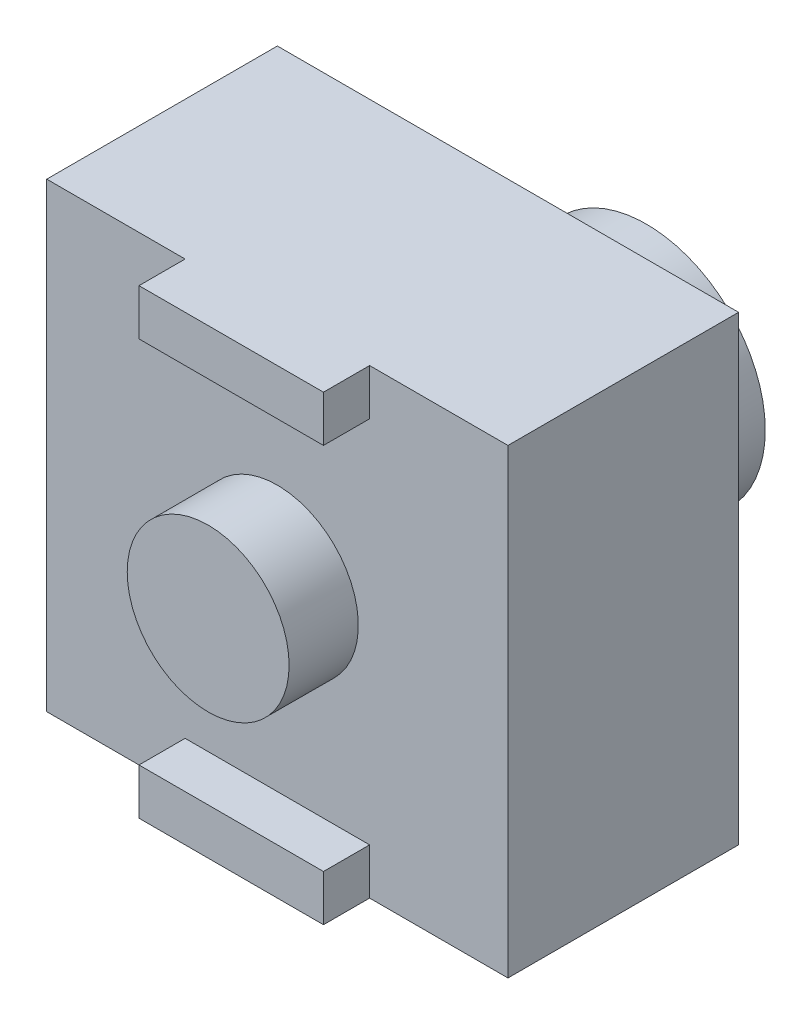
ISO-10303-21;
HEADER;
FILE_DESCRIPTION(('STEP AP214'),'2;1');
FILE_NAME('part.step','',(''),(''),'','','');
FILE_SCHEMA(('AUTOMOTIVE_DESIGN { 1 0 10303 214 1 1 1 1 }'));
ENDSEC;
DATA;
#1=APPLICATION_CONTEXT('core data for automotive mechanical design processes');
#2=APPLICATION_PROTOCOL_DEFINITION('international standard','automotive_design',2000,#1);
#3=PRODUCT_CONTEXT('',#1,'mechanical');
#4=PRODUCT('Part','Part','',(#3));
#5=PRODUCT_RELATED_PRODUCT_CATEGORY('part','',(#4));
#6=PRODUCT_DEFINITION_FORMATION('','',#4);
#7=PRODUCT_DEFINITION_CONTEXT('part definition',#1,'design');
#8=PRODUCT_DEFINITION('design','',#6,#7);
#9=PRODUCT_DEFINITION_SHAPE('','',#8);
#10=(LENGTH_UNIT() NAMED_UNIT(*) SI_UNIT(.MILLI.,.METRE.));
#11=(NAMED_UNIT(*) PLANE_ANGLE_UNIT() SI_UNIT($,.RADIAN.));
#12=(NAMED_UNIT(*) SI_UNIT($,.STERADIAN.) SOLID_ANGLE_UNIT());
#13=UNCERTAINTY_MEASURE_WITH_UNIT(LENGTH_MEASURE(1.E-05),#10,'distance_accuracy_value','');
#14=(GEOMETRIC_REPRESENTATION_CONTEXT(3) GLOBAL_UNCERTAINTY_ASSIGNED_CONTEXT((#13)) GLOBAL_UNIT_ASSIGNED_CONTEXT((#10,
#11,#12)) REPRESENTATION_CONTEXT('',''));
#15=CARTESIAN_POINT('',(0.,0.,0.));
#16=DIRECTION('',(0.,0.,1.));
#17=DIRECTION('',(1.,0.,0.));
#18=AXIS2_PLACEMENT_3D('',#15,#16,#17);
#19=CARTESIAN_POINT('',(0.,0.,5.));
#20=DIRECTION('',(0.,0.,-1.));
#21=DIRECTION('',(-1.,0.,0.));
#22=AXIS2_PLACEMENT_3D('',#19,#20,#21);
#23=PLANE('',#22);
#24=DIRECTION('',(1.,0.,0.));
#25=VECTOR('',#24,1.);
#26=CARTESIAN_POINT('',(0.,0.,5.));
#27=LINE('',#26,#25);
#28=CARTESIAN_POINT('',(0.,0.,5.));
#29=VERTEX_POINT('',#28);
#30=CARTESIAN_POINT('',(3.,0.,5.));
#31=VERTEX_POINT('',#30);
#32=EDGE_CURVE('E240',#29,#31,#27,.T.);
#33=ORIENTED_EDGE('',*,*,#32,.T.);
#34=DIRECTION('',(0.,1.,0.));
#35=VECTOR('',#34,1.);
#36=CARTESIAN_POINT('',(3.,0.,5.));
#37=LINE('',#36,#35);
#38=CARTESIAN_POINT('',(3.,0.999999999999999,5.));
#39=VERTEX_POINT('',#38);
#40=EDGE_CURVE('E62',#31,#39,#37,.T.);
#41=ORIENTED_EDGE('',*,*,#40,.T.);
#42=DIRECTION('',(1.,0.,0.));
#43=VECTOR('',#42,1.);
#44=CARTESIAN_POINT('',(3.,0.999999999999999,5.));
#45=LINE('',#44,#43);
#46=CARTESIAN_POINT('',(7.,0.999999999999997,5.));
#47=VERTEX_POINT('',#46);
#48=EDGE_CURVE('E57',#39,#47,#45,.T.);
#49=ORIENTED_EDGE('',*,*,#48,.T.);
#50=DIRECTION('',(0.,-1.,0.));
#51=VECTOR('',#50,1.);
#52=CARTESIAN_POINT('',(7.,0.,5.));
#53=LINE('',#52,#51);
#54=CARTESIAN_POINT('',(7.,0.,5.));
#55=VERTEX_POINT('',#54);
#56=EDGE_CURVE('E165',#47,#55,#53,.T.);
#57=ORIENTED_EDGE('',*,*,#56,.T.);
#58=CARTESIAN_POINT('',(10.,0.,5.));
#59=VERTEX_POINT('',#58);
#60=EDGE_CURVE('E238',#55,#59,#27,.T.);
#61=ORIENTED_EDGE('',*,*,#60,.T.);
#62=DIRECTION('',(0.,1.,0.));
#63=VECTOR('',#62,1.);
#64=CARTESIAN_POINT('',(10.,0.,5.));
#65=LINE('',#64,#63);
#66=CARTESIAN_POINT('',(10.,10.,5.));
#67=VERTEX_POINT('',#66);
#68=EDGE_CURVE('E243',#59,#67,#65,.T.);
#69=ORIENTED_EDGE('',*,*,#68,.T.);
#70=DIRECTION('',(-1.,0.,0.));
#71=VECTOR('',#70,1.);
#72=CARTESIAN_POINT('',(0.,10.,5.));
#73=LINE('',#72,#71);
#74=CARTESIAN_POINT('',(7.,10.,5.));
#75=VERTEX_POINT('',#74);
#76=EDGE_CURVE('E247',#67,#75,#73,.T.);
#77=ORIENTED_EDGE('',*,*,#76,.T.);
#78=DIRECTION('',(0.,1.,0.));
#79=VECTOR('',#78,1.);
#80=CARTESIAN_POINT('',(7.,10.,5.));
#81=LINE('',#80,#79);
#82=CARTESIAN_POINT('',(7.,9.,5.));
#83=VERTEX_POINT('',#82);
#84=EDGE_CURVE('E182',#83,#75,#81,.T.);
#85=ORIENTED_EDGE('',*,*,#84,.F.);
#86=DIRECTION('',(1.,0.,0.));
#87=VECTOR('',#86,1.);
#88=CARTESIAN_POINT('',(3.,9.,5.));
#89=LINE('',#88,#87);
#90=CARTESIAN_POINT('',(3.,9.,5.));
#91=VERTEX_POINT('',#90);
#92=EDGE_CURVE('E195',#91,#83,#89,.T.);
#93=ORIENTED_EDGE('',*,*,#92,.F.);
#94=DIRECTION('',(0.,-1.,0.));
#95=VECTOR('',#94,1.);
#96=CARTESIAN_POINT('',(3.,10.,5.));
#97=LINE('',#96,#95);
#98=CARTESIAN_POINT('',(3.,10.,5.));
#99=VERTEX_POINT('',#98);
#100=EDGE_CURVE('E139',#99,#91,#97,.T.);
#101=ORIENTED_EDGE('',*,*,#100,.F.);
#102=CARTESIAN_POINT('',(0.,10.,5.));
#103=VERTEX_POINT('',#102);
#104=EDGE_CURVE('E246',#99,#103,#73,.T.);
#105=ORIENTED_EDGE('',*,*,#104,.T.);
#106=DIRECTION('',(0.,-1.,0.));
#107=VECTOR('',#106,1.);
#108=CARTESIAN_POINT('',(0.,0.,5.));
#109=LINE('',#108,#107);
#110=EDGE_CURVE('E234',#103,#29,#109,.T.);
#111=ORIENTED_EDGE('',*,*,#110,.T.);
#112=EDGE_LOOP('',(#33,#41,#49,#57,#61,#69,#77,#85,#93,#101,#105,#111));
#113=FACE_BOUND('',#112,.T.);
#114=CARTESIAN_POINT('',(5.,5.,5.));
#115=DIRECTION('',(0.,0.,-1.));
#116=DIRECTION('',(-1.,0.,0.));
#117=AXIS2_PLACEMENT_3D('',#114,#115,#116);
#118=CIRCLE('',#117,1.755);
#119=CARTESIAN_POINT('',(3.245,5.,5.));
#120=VERTEX_POINT('',#119);
#121=EDGE_CURVE('E221',#120,#120,#118,.F.);
#122=ORIENTED_EDGE('',*,*,#121,.F.);
#123=EDGE_LOOP('',(#122));
#124=FACE_BOUND('',#123,.T.);
#125=ADVANCED_FACE('F41',(#113,#124),#23,.F.);
#126=CARTESIAN_POINT('',(0.,0.,5.));
#127=DIRECTION('',(1.,0.,0.));
#128=DIRECTION('',(0.,0.,-1.));
#129=AXIS2_PLACEMENT_3D('',#126,#127,#128);
#130=PLANE('',#129);
#131=DIRECTION('',(0.,-1.,0.));
#132=VECTOR('',#131,1.);
#133=CARTESIAN_POINT('',(0.,0.,0.));
#134=LINE('',#133,#132);
#135=CARTESIAN_POINT('',(0.,10.,0.));
#136=VERTEX_POINT('',#135);
#137=CARTESIAN_POINT('',(0.,0.,0.));
#138=VERTEX_POINT('',#137);
#139=EDGE_CURVE('E233',#136,#138,#134,.T.);
#140=ORIENTED_EDGE('',*,*,#139,.T.);
#141=DIRECTION('',(0.,0.,-1.));
#142=VECTOR('',#141,1.);
#143=CARTESIAN_POINT('',(0.,0.,5.));
#144=LINE('',#143,#142);
#145=EDGE_CURVE('E11',#29,#138,#144,.T.);
#146=ORIENTED_EDGE('',*,*,#145,.F.);
#147=ORIENTED_EDGE('',*,*,#110,.F.);
#148=DIRECTION('',(0.,0.,-1.));
#149=VECTOR('',#148,1.);
#150=CARTESIAN_POINT('',(0.,10.,5.));
#151=LINE('',#150,#149);
#152=EDGE_CURVE('E250',#103,#136,#151,.T.);
#153=ORIENTED_EDGE('',*,*,#152,.T.);
#154=EDGE_LOOP('',(#140,#146,#147,#153));
#155=FACE_BOUND('',#154,.T.);
#156=ADVANCED_FACE('F43',(#155),#130,.F.);
#157=CARTESIAN_POINT('',(0.,0.,5.));
#158=DIRECTION('',(0.,1.,0.));
#159=DIRECTION('',(0.,0.,1.));
#160=AXIS2_PLACEMENT_3D('',#157,#158,#159);
#161=PLANE('',#160);
#162=DIRECTION('',(1.,0.,0.));
#163=VECTOR('',#162,1.);
#164=CARTESIAN_POINT('',(0.,0.,0.));
#165=LINE('',#164,#163);
#166=CARTESIAN_POINT('',(10.,0.,0.));
#167=VERTEX_POINT('',#166);
#168=EDGE_CURVE('E254',#138,#167,#165,.T.);
#169=ORIENTED_EDGE('',*,*,#168,.T.);
#170=DIRECTION('',(0.,0.,-1.));
#171=VECTOR('',#170,1.);
#172=CARTESIAN_POINT('',(10.,0.,5.));
#173=LINE('',#172,#171);
#174=EDGE_CURVE('E50',#59,#167,#173,.T.);
#175=ORIENTED_EDGE('',*,*,#174,.F.);
#176=ORIENTED_EDGE('',*,*,#60,.F.);
#177=DIRECTION('',(0.,0.,-1.));
#178=VECTOR('',#177,1.);
#179=CARTESIAN_POINT('',(7.,0.,6.));
#180=LINE('',#179,#178);
#181=CARTESIAN_POINT('',(7.,0.,6.));
#182=VERTEX_POINT('',#181);
#183=EDGE_CURVE('E140',#182,#55,#180,.T.);
#184=ORIENTED_EDGE('',*,*,#183,.F.);
#185=DIRECTION('',(-1.,0.,0.));
#186=VECTOR('',#185,1.);
#187=CARTESIAN_POINT('',(3.,0.,6.));
#188=LINE('',#187,#186);
#189=CARTESIAN_POINT('',(3.,0.,6.));
#190=VERTEX_POINT('',#189);
#191=EDGE_CURVE('E146',#182,#190,#188,.T.);
#192=ORIENTED_EDGE('',*,*,#191,.T.);
#193=DIRECTION('',(0.,0.,-1.));
#194=VECTOR('',#193,1.);
#195=CARTESIAN_POINT('',(3.,0.,6.));
#196=LINE('',#195,#194);
#197=EDGE_CURVE('E131',#190,#31,#196,.T.);
#198=ORIENTED_EDGE('',*,*,#197,.T.);
#199=ORIENTED_EDGE('',*,*,#32,.F.);
#200=ORIENTED_EDGE('',*,*,#145,.T.);
#201=EDGE_LOOP('',(#169,#175,#176,#184,#192,#198,#199,#200));
#202=FACE_BOUND('',#201,.T.);
#203=ADVANCED_FACE('F152',(#202),#161,.F.);
#204=CARTESIAN_POINT('',(10.,0.,5.));
#205=DIRECTION('',(-1.,0.,0.));
#206=DIRECTION('',(0.,0.,1.));
#207=AXIS2_PLACEMENT_3D('',#204,#205,#206);
#208=PLANE('',#207);
#209=DIRECTION('',(0.,1.,0.));
#210=VECTOR('',#209,1.);
#211=CARTESIAN_POINT('',(10.,0.,0.));
#212=LINE('',#211,#210);
#213=CARTESIAN_POINT('',(10.,10.,0.));
#214=VERTEX_POINT('',#213);
#215=EDGE_CURVE('E257',#167,#214,#212,.T.);
#216=ORIENTED_EDGE('',*,*,#215,.T.);
#217=DIRECTION('',(0.,0.,-1.));
#218=VECTOR('',#217,1.);
#219=CARTESIAN_POINT('',(10.,10.,5.));
#220=LINE('',#219,#218);
#221=EDGE_CURVE('E265',#67,#214,#220,.T.);
#222=ORIENTED_EDGE('',*,*,#221,.F.);
#223=ORIENTED_EDGE('',*,*,#68,.F.);
#224=ORIENTED_EDGE('',*,*,#174,.T.);
#225=EDGE_LOOP('',(#216,#222,#223,#224));
#226=FACE_BOUND('',#225,.T.);
#227=ADVANCED_FACE('F274',(#226),#208,.F.);
#228=CARTESIAN_POINT('',(0.,10.,5.));
#229=DIRECTION('',(0.,-1.,0.));
#230=DIRECTION('',(0.,0.,-1.));
#231=AXIS2_PLACEMENT_3D('',#228,#229,#230);
#232=PLANE('',#231);
#233=DIRECTION('',(-1.,0.,0.));
#234=VECTOR('',#233,1.);
#235=CARTESIAN_POINT('',(0.,10.,0.));
#236=LINE('',#235,#234);
#237=EDGE_CURVE('E239',#214,#136,#236,.T.);
#238=ORIENTED_EDGE('',*,*,#237,.T.);
#239=ORIENTED_EDGE('',*,*,#152,.F.);
#240=ORIENTED_EDGE('',*,*,#104,.F.);
#241=DIRECTION('',(0.,0.,-1.));
#242=VECTOR('',#241,1.);
#243=CARTESIAN_POINT('',(3.,10.,6.));
#244=LINE('',#243,#242);
#245=CARTESIAN_POINT('',(3.,10.,6.));
#246=VERTEX_POINT('',#245);
#247=EDGE_CURVE('E191',#246,#99,#244,.T.);
#248=ORIENTED_EDGE('',*,*,#247,.F.);
#249=DIRECTION('',(-1.,0.,0.));
#250=VECTOR('',#249,1.);
#251=CARTESIAN_POINT('',(3.,10.,6.));
#252=LINE('',#251,#250);
#253=CARTESIAN_POINT('',(7.,10.,6.));
#254=VERTEX_POINT('',#253);
#255=EDGE_CURVE('E188',#254,#246,#252,.T.);
#256=ORIENTED_EDGE('',*,*,#255,.F.);
#257=DIRECTION('',(0.,0.,-1.));
#258=VECTOR('',#257,1.);
#259=CARTESIAN_POINT('',(7.,10.,6.));
#260=LINE('',#259,#258);
#261=EDGE_CURVE('E205',#254,#75,#260,.T.);
#262=ORIENTED_EDGE('',*,*,#261,.T.);
#263=ORIENTED_EDGE('',*,*,#76,.F.);
#264=ORIENTED_EDGE('',*,*,#221,.T.);
#265=EDGE_LOOP('',(#238,#239,#240,#248,#256,#262,#263,#264));
#266=FACE_BOUND('',#265,.T.);
#267=ADVANCED_FACE('F282',(#266),#232,.F.);
#268=CARTESIAN_POINT('',(0.,0.,0.));
#269=DIRECTION('',(0.,0.,-1.));
#270=DIRECTION('',(-1.,0.,0.));
#271=AXIS2_PLACEMENT_3D('',#268,#269,#270);
#272=PLANE('',#271);
#273=CARTESIAN_POINT('',(5.,5.07854843993545,0.));
#274=DIRECTION('',(0.,0.,-1.));
#275=DIRECTION('',(-1.,0.,0.));
#276=AXIS2_PLACEMENT_3D('',#273,#274,#275);
#277=CIRCLE('',#276,2.57854843993545);
#278=CARTESIAN_POINT('',(2.42145156006455,5.07854843993545,0.));
#279=VERTEX_POINT('',#278);
#280=EDGE_CURVE('E229',#279,#279,#277,.F.);
#281=ORIENTED_EDGE('',*,*,#280,.T.);
#282=EDGE_LOOP('',(#281));
#283=FACE_BOUND('',#282,.T.);
#284=ORIENTED_EDGE('',*,*,#139,.F.);
#285=ORIENTED_EDGE('',*,*,#237,.F.);
#286=ORIENTED_EDGE('',*,*,#215,.F.);
#287=ORIENTED_EDGE('',*,*,#168,.F.);
#288=EDGE_LOOP('',(#284,#285,#286,#287));
#289=FACE_BOUND('',#288,.T.);
#290=ADVANCED_FACE('F279',(#283,#289),#272,.T.);
#291=CARTESIAN_POINT('',(5.,5.07854843993545,-3.));
#292=DIRECTION('',(0.,0.,1.));
#293=DIRECTION('',(1.,0.,0.));
#294=AXIS2_PLACEMENT_3D('',#291,#292,#293);
#295=CYLINDRICAL_SURFACE('',#294,2.57854843993545);
#296=ORIENTED_EDGE('',*,*,#280,.F.);
#297=EDGE_LOOP('',(#296));
#298=FACE_BOUND('',#297,.T.);
#299=CARTESIAN_POINT('',(5.,5.07854843993545,-3.));
#300=DIRECTION('',(0.,0.,-1.));
#301=DIRECTION('',(-1.,0.,0.));
#302=AXIS2_PLACEMENT_3D('',#299,#300,#301);
#303=CIRCLE('',#302,2.57854843993545);
#304=CARTESIAN_POINT('',(2.42145156006455,5.07854843993545,-3.));
#305=VERTEX_POINT('',#304);
#306=EDGE_CURVE('E225',#305,#305,#303,.T.);
#307=ORIENTED_EDGE('',*,*,#306,.F.);
#308=EDGE_LOOP('',(#307));
#309=FACE_BOUND('',#308,.T.);
#310=ADVANCED_FACE('F312',(#298,#309),#295,.T.);
#311=CARTESIAN_POINT('',(5.,5.07854843993545,-3.));
#312=DIRECTION('',(0.,0.,-1.));
#313=DIRECTION('',(-1.,0.,0.));
#314=AXIS2_PLACEMENT_3D('',#311,#312,#313);
#315=PLANE('',#314);
#316=ORIENTED_EDGE('',*,*,#306,.T.);
#317=EDGE_LOOP('',(#316));
#318=FACE_BOUND('',#317,.T.);
#319=ADVANCED_FACE('F347',(#318),#315,.T.);
#320=CARTESIAN_POINT('',(5.,5.,6.5));
#321=DIRECTION('',(0.,0.,-1.));
#322=DIRECTION('',(-1.,0.,0.));
#323=AXIS2_PLACEMENT_3D('',#320,#321,#322);
#324=CYLINDRICAL_SURFACE('',#323,1.755);
#325=CARTESIAN_POINT('',(5.,5.,6.5));
#326=DIRECTION('',(0.,0.,1.));
#327=DIRECTION('',(1.,0.,0.));
#328=AXIS2_PLACEMENT_3D('',#325,#326,#327);
#329=CIRCLE('',#328,1.755);
#330=CARTESIAN_POINT('',(6.755,5.,6.5));
#331=VERTEX_POINT('',#330);
#332=EDGE_CURVE('E217',#331,#331,#329,.T.);
#333=ORIENTED_EDGE('',*,*,#332,.F.);
#334=EDGE_LOOP('',(#333));
#335=FACE_BOUND('',#334,.T.);
#336=ORIENTED_EDGE('',*,*,#121,.T.);
#337=EDGE_LOOP('',(#336));
#338=FACE_BOUND('',#337,.T.);
#339=ADVANCED_FACE('F354',(#335,#338),#324,.T.);
#340=CARTESIAN_POINT('',(5.,5.,6.5));
#341=DIRECTION('',(0.,0.,1.));
#342=DIRECTION('',(1.,0.,0.));
#343=AXIS2_PLACEMENT_3D('',#340,#341,#342);
#344=PLANE('',#343);
#345=ORIENTED_EDGE('',*,*,#332,.T.);
#346=EDGE_LOOP('',(#345));
#347=FACE_BOUND('',#346,.T.);
#348=ADVANCED_FACE('F360',(#347),#344,.T.);
#349=CARTESIAN_POINT('',(3.,10.,6.));
#350=DIRECTION('',(1.,0.,0.));
#351=DIRECTION('',(0.,1.,0.));
#352=AXIS2_PLACEMENT_3D('',#349,#350,#351);
#353=PLANE('',#352);
#354=ORIENTED_EDGE('',*,*,#100,.T.);
#355=DIRECTION('',(0.,0.,-1.));
#356=VECTOR('',#355,1.);
#357=CARTESIAN_POINT('',(3.,9.,6.));
#358=LINE('',#357,#356);
#359=CARTESIAN_POINT('',(3.,9.,6.));
#360=VERTEX_POINT('',#359);
#361=EDGE_CURVE('E213',#360,#91,#358,.T.);
#362=ORIENTED_EDGE('',*,*,#361,.F.);
#363=DIRECTION('',(0.,-1.,0.));
#364=VECTOR('',#363,1.);
#365=CARTESIAN_POINT('',(3.,10.,6.));
#366=LINE('',#365,#364);
#367=EDGE_CURVE('E177',#246,#360,#366,.T.);
#368=ORIENTED_EDGE('',*,*,#367,.F.);
#369=ORIENTED_EDGE('',*,*,#247,.T.);
#370=EDGE_LOOP('',(#354,#362,#368,#369));
#371=FACE_BOUND('',#370,.T.);
#372=ADVANCED_FACE('F368',(#371),#353,.F.);
#373=CARTESIAN_POINT('',(3.,9.,6.));
#374=DIRECTION('',(0.,1.,0.));
#375=DIRECTION('',(-1.,0.,0.));
#376=AXIS2_PLACEMENT_3D('',#373,#374,#375);
#377=PLANE('',#376);
#378=ORIENTED_EDGE('',*,*,#92,.T.);
#379=DIRECTION('',(0.,0.,-1.));
#380=VECTOR('',#379,1.);
#381=CARTESIAN_POINT('',(7.,9.,6.));
#382=LINE('',#381,#380);
#383=CARTESIAN_POINT('',(7.,9.,6.));
#384=VERTEX_POINT('',#383);
#385=EDGE_CURVE('E209',#384,#83,#382,.T.);
#386=ORIENTED_EDGE('',*,*,#385,.F.);
#387=DIRECTION('',(1.,0.,0.));
#388=VECTOR('',#387,1.);
#389=CARTESIAN_POINT('',(3.,9.,6.));
#390=LINE('',#389,#388);
#391=EDGE_CURVE('E181',#360,#384,#390,.T.);
#392=ORIENTED_EDGE('',*,*,#391,.F.);
#393=ORIENTED_EDGE('',*,*,#361,.T.);
#394=EDGE_LOOP('',(#378,#386,#392,#393));
#395=FACE_BOUND('',#394,.T.);
#396=ADVANCED_FACE('F374',(#395),#377,.F.);
#397=CARTESIAN_POINT('',(7.,10.,6.));
#398=DIRECTION('',(-1.,0.,0.));
#399=DIRECTION('',(0.,0.,1.));
#400=AXIS2_PLACEMENT_3D('',#397,#398,#399);
#401=PLANE('',#400);
#402=ORIENTED_EDGE('',*,*,#84,.T.);
#403=ORIENTED_EDGE('',*,*,#261,.F.);
#404=DIRECTION('',(0.,1.,0.));
#405=VECTOR('',#404,1.);
#406=CARTESIAN_POINT('',(7.,10.,6.));
#407=LINE('',#406,#405);
#408=EDGE_CURVE('E185',#384,#254,#407,.T.);
#409=ORIENTED_EDGE('',*,*,#408,.F.);
#410=ORIENTED_EDGE('',*,*,#385,.T.);
#411=EDGE_LOOP('',(#402,#403,#409,#410));
#412=FACE_BOUND('',#411,.T.);
#413=ADVANCED_FACE('F382',(#412),#401,.F.);
#414=CARTESIAN_POINT('',(0.,0.,6.));
#415=DIRECTION('',(0.,0.,1.));
#416=DIRECTION('',(1.,0.,0.));
#417=AXIS2_PLACEMENT_3D('',#414,#415,#416);
#418=PLANE('',#417);
#419=ORIENTED_EDGE('',*,*,#367,.T.);
#420=ORIENTED_EDGE('',*,*,#391,.T.);
#421=ORIENTED_EDGE('',*,*,#408,.T.);
#422=ORIENTED_EDGE('',*,*,#255,.T.);
#423=EDGE_LOOP('',(#419,#420,#421,#422));
#424=FACE_BOUND('',#423,.T.);
#425=ADVANCED_FACE('F390',(#424),#418,.T.);
#426=CARTESIAN_POINT('',(3.,0.,6.));
#427=DIRECTION('',(-1.,0.,0.));
#428=DIRECTION('',(0.,-1.,0.));
#429=AXIS2_PLACEMENT_3D('',#426,#427,#428);
#430=PLANE('',#429);
#431=ORIENTED_EDGE('',*,*,#40,.F.);
#432=ORIENTED_EDGE('',*,*,#197,.F.);
#433=DIRECTION('',(0.,1.,0.));
#434=VECTOR('',#433,1.);
#435=CARTESIAN_POINT('',(3.,0.,6.));
#436=LINE('',#435,#434);
#437=CARTESIAN_POINT('',(3.,0.999999999999999,6.));
#438=VERTEX_POINT('',#437);
#439=EDGE_CURVE('E134',#190,#438,#436,.T.);
#440=ORIENTED_EDGE('',*,*,#439,.T.);
#441=DIRECTION('',(0.,0.,-1.));
#442=VECTOR('',#441,1.);
#443=CARTESIAN_POINT('',(3.,0.999999999999999,6.));
#444=LINE('',#443,#442);
#445=EDGE_CURVE('E162',#438,#39,#444,.T.);
#446=ORIENTED_EDGE('',*,*,#445,.T.);
#447=EDGE_LOOP('',(#431,#432,#440,#446));
#448=FACE_BOUND('',#447,.T.);
#449=ADVANCED_FACE('F133',(#448),#430,.T.);
#450=CARTESIAN_POINT('',(7.,0.,6.));
#451=DIRECTION('',(1.,0.,0.));
#452=DIRECTION('',(0.,0.,-1.));
#453=AXIS2_PLACEMENT_3D('',#450,#451,#452);
#454=PLANE('',#453);
#455=ORIENTED_EDGE('',*,*,#56,.F.);
#456=DIRECTION('',(0.,0.,-1.));
#457=VECTOR('',#456,1.);
#458=CARTESIAN_POINT('',(7.,0.999999999999997,6.));
#459=LINE('',#458,#457);
#460=CARTESIAN_POINT('',(7.,0.999999999999997,6.));
#461=VERTEX_POINT('',#460);
#462=EDGE_CURVE('E172',#461,#47,#459,.T.);
#463=ORIENTED_EDGE('',*,*,#462,.F.);
#464=DIRECTION('',(0.,-1.,0.));
#465=VECTOR('',#464,1.);
#466=CARTESIAN_POINT('',(7.,0.,6.));
#467=LINE('',#466,#465);
#468=EDGE_CURVE('E155',#461,#182,#467,.T.);
#469=ORIENTED_EDGE('',*,*,#468,.T.);
#470=ORIENTED_EDGE('',*,*,#183,.T.);
#471=EDGE_LOOP('',(#455,#463,#469,#470));
#472=FACE_BOUND('',#471,.T.);
#473=ADVANCED_FACE('F294',(#472),#454,.T.);
#474=CARTESIAN_POINT('',(3.,0.999999999999999,6.));
#475=DIRECTION('',(0.,1.,0.));
#476=DIRECTION('',(-1.,0.,0.));
#477=AXIS2_PLACEMENT_3D('',#474,#475,#476);
#478=PLANE('',#477);
#479=ORIENTED_EDGE('',*,*,#48,.F.);
#480=ORIENTED_EDGE('',*,*,#445,.F.);
#481=DIRECTION('',(1.,0.,0.));
#482=VECTOR('',#481,1.);
#483=CARTESIAN_POINT('',(3.,0.999999999999999,6.));
#484=LINE('',#483,#482);
#485=EDGE_CURVE('E149',#438,#461,#484,.T.);
#486=ORIENTED_EDGE('',*,*,#485,.T.);
#487=ORIENTED_EDGE('',*,*,#462,.T.);
#488=EDGE_LOOP('',(#479,#480,#486,#487));
#489=FACE_BOUND('',#488,.T.);
#490=ADVANCED_FACE('F296',(#489),#478,.T.);
#491=CARTESIAN_POINT('',(0.,10.,6.));
#492=DIRECTION('',(0.,0.,1.));
#493=DIRECTION('',(1.,0.,0.));
#494=AXIS2_PLACEMENT_3D('',#491,#492,#493);
#495=PLANE('',#494);
#496=ORIENTED_EDGE('',*,*,#439,.F.);
#497=ORIENTED_EDGE('',*,*,#191,.F.);
#498=ORIENTED_EDGE('',*,*,#468,.F.);
#499=ORIENTED_EDGE('',*,*,#485,.F.);
#500=EDGE_LOOP('',(#496,#497,#498,#499));
#501=FACE_BOUND('',#500,.T.);
#502=ADVANCED_FACE('F144',(#501),#495,.T.);
#503=CLOSED_SHELL('',(#125,#156,#203,#227,#267,#290,#310,#319,#339,#348,#372,#396,#413,#425,
#449,#473,#490,#502));
#504=MANIFOLD_SOLID_BREP('B2',#503);
#505=ADVANCED_BREP_SHAPE_REPRESENTATION('',(#18,#504),#14);
#506=SHAPE_DEFINITION_REPRESENTATION(#9,#505);
ENDSEC;
END-ISO-10303-21;
